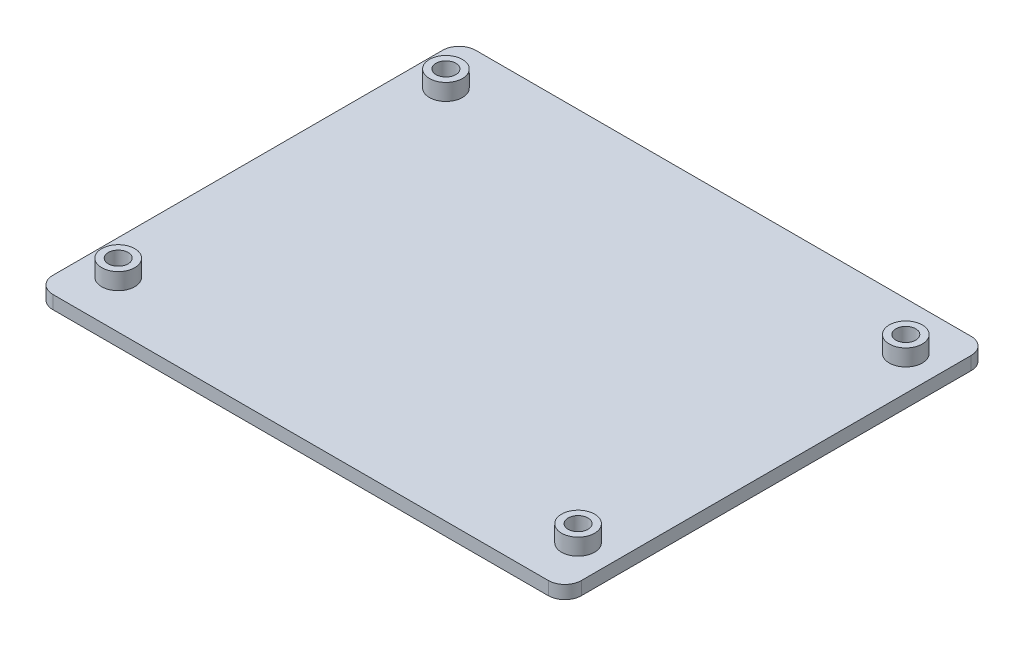
ISO-10303-21;
HEADER;
FILE_DESCRIPTION(('STEP AP214'),'2;1');
FILE_NAME('part.step','',(''),(''),'','','');
FILE_SCHEMA(('AUTOMOTIVE_DESIGN { 1 0 10303 214 1 1 1 1 }'));
ENDSEC;
DATA;
#1=APPLICATION_CONTEXT('core data for automotive mechanical design processes');
#2=APPLICATION_PROTOCOL_DEFINITION('international standard','automotive_design',2000,#1);
#3=PRODUCT_CONTEXT('',#1,'mechanical');
#4=PRODUCT('Part','Part','',(#3));
#5=PRODUCT_RELATED_PRODUCT_CATEGORY('part','',(#4));
#6=PRODUCT_DEFINITION_FORMATION('','',#4);
#7=PRODUCT_DEFINITION_CONTEXT('part definition',#1,'design');
#8=PRODUCT_DEFINITION('design','',#6,#7);
#9=PRODUCT_DEFINITION_SHAPE('','',#8);
#10=(LENGTH_UNIT() NAMED_UNIT(*) SI_UNIT(.MILLI.,.METRE.));
#11=(NAMED_UNIT(*) PLANE_ANGLE_UNIT() SI_UNIT($,.RADIAN.));
#12=(NAMED_UNIT(*) SI_UNIT($,.STERADIAN.) SOLID_ANGLE_UNIT());
#13=UNCERTAINTY_MEASURE_WITH_UNIT(LENGTH_MEASURE(1.E-05),#10,'distance_accuracy_value','');
#14=(GEOMETRIC_REPRESENTATION_CONTEXT(3) GLOBAL_UNCERTAINTY_ASSIGNED_CONTEXT((#13)) GLOBAL_UNIT_ASSIGNED_CONTEXT((#10,
#11,#12)) REPRESENTATION_CONTEXT('',''));
#15=CARTESIAN_POINT('',(0.,0.,0.));
#16=DIRECTION('',(0.,0.,1.));
#17=DIRECTION('',(1.,0.,0.));
#18=AXIS2_PLACEMENT_3D('',#15,#16,#17);
#19=CARTESIAN_POINT('',(40.,2.,32.));
#20=DIRECTION('',(-1.,0.,0.));
#21=DIRECTION('',(0.,0.,1.));
#22=AXIS2_PLACEMENT_3D('',#19,#20,#21);
#23=PLANE('',#22);
#24=DIRECTION('',(0.,0.,-1.));
#25=VECTOR('',#24,1.);
#26=CARTESIAN_POINT('',(40.,0.,32.));
#27=LINE('',#26,#25);
#28=CARTESIAN_POINT('',(40.,0.,29.5));
#29=VERTEX_POINT('',#28);
#30=CARTESIAN_POINT('',(40.,0.,-29.5));
#31=VERTEX_POINT('',#30);
#32=EDGE_CURVE('E149',#29,#31,#27,.T.);
#33=ORIENTED_EDGE('',*,*,#32,.T.);
#34=DIRECTION('',(0.,-1.,0.));
#35=VECTOR('',#34,1.);
#36=CARTESIAN_POINT('',(40.,2.,-29.5));
#37=LINE('',#36,#35);
#38=CARTESIAN_POINT('',(40.,2.,-29.5));
#39=VERTEX_POINT('',#38);
#40=EDGE_CURVE('E182',#31,#39,#37,.F.);
#41=ORIENTED_EDGE('',*,*,#40,.T.);
#42=DIRECTION('',(0.,0.,-1.));
#43=VECTOR('',#42,1.);
#44=CARTESIAN_POINT('',(40.,2.,32.));
#45=LINE('',#44,#43);
#46=CARTESIAN_POINT('',(40.,2.,29.5));
#47=VERTEX_POINT('',#46);
#48=EDGE_CURVE('E147',#47,#39,#45,.T.);
#49=ORIENTED_EDGE('',*,*,#48,.F.);
#50=DIRECTION('',(0.,-1.,0.));
#51=VECTOR('',#50,1.);
#52=CARTESIAN_POINT('',(40.,2.,29.5));
#53=LINE('',#52,#51);
#54=EDGE_CURVE('E178',#47,#29,#53,.T.);
#55=ORIENTED_EDGE('',*,*,#54,.T.);
#56=EDGE_LOOP('',(#33,#41,#49,#55));
#57=FACE_BOUND('',#56,.T.);
#58=ADVANCED_FACE('F45',(#57),#23,.F.);
#59=CARTESIAN_POINT('',(-40.,2.,-32.));
#60=DIRECTION('',(0.,0.,1.));
#61=DIRECTION('',(1.,0.,0.));
#62=AXIS2_PLACEMENT_3D('',#59,#60,#61);
#63=PLANE('',#62);
#64=DIRECTION('',(-1.,0.,0.));
#65=VECTOR('',#64,1.);
#66=CARTESIAN_POINT('',(-40.,0.,-32.));
#67=LINE('',#66,#65);
#68=CARTESIAN_POINT('',(37.5,0.,-32.));
#69=VERTEX_POINT('',#68);
#70=CARTESIAN_POINT('',(-37.5,0.,-32.));
#71=VERTEX_POINT('',#70);
#72=EDGE_CURVE('E143',#69,#71,#67,.T.);
#73=ORIENTED_EDGE('',*,*,#72,.T.);
#74=DIRECTION('',(0.,-1.,0.));
#75=VECTOR('',#74,1.);
#76=CARTESIAN_POINT('',(-37.5,2.,-32.));
#77=LINE('',#76,#75);
#78=CARTESIAN_POINT('',(-37.5,2.,-32.));
#79=VERTEX_POINT('',#78);
#80=EDGE_CURVE('E118',#71,#79,#77,.F.);
#81=ORIENTED_EDGE('',*,*,#80,.T.);
#82=DIRECTION('',(-1.,0.,0.));
#83=VECTOR('',#82,1.);
#84=CARTESIAN_POINT('',(-40.,2.,-32.));
#85=LINE('',#84,#83);
#86=CARTESIAN_POINT('',(37.5,2.,-32.));
#87=VERTEX_POINT('',#86);
#88=EDGE_CURVE('E215',#87,#79,#85,.T.);
#89=ORIENTED_EDGE('',*,*,#88,.F.);
#90=DIRECTION('',(0.,-1.,0.));
#91=VECTOR('',#90,1.);
#92=CARTESIAN_POINT('',(37.5,2.,-32.));
#93=LINE('',#92,#91);
#94=EDGE_CURVE('E124',#87,#69,#93,.T.);
#95=ORIENTED_EDGE('',*,*,#94,.T.);
#96=EDGE_LOOP('',(#73,#81,#89,#95));
#97=FACE_BOUND('',#96,.T.);
#98=ADVANCED_FACE('F306',(#97),#63,.F.);
#99=CARTESIAN_POINT('',(-40.,2.,32.));
#100=DIRECTION('',(1.,0.,0.));
#101=DIRECTION('',(0.,0.,-1.));
#102=AXIS2_PLACEMENT_3D('',#99,#100,#101);
#103=PLANE('',#102);
#104=DIRECTION('',(0.,0.,1.));
#105=VECTOR('',#104,1.);
#106=CARTESIAN_POINT('',(-40.,2.,32.));
#107=LINE('',#106,#105);
#108=CARTESIAN_POINT('',(-40.,2.,-29.5));
#109=VERTEX_POINT('',#108);
#110=CARTESIAN_POINT('',(-40.,2.,29.5));
#111=VERTEX_POINT('',#110);
#112=EDGE_CURVE('E133',#109,#111,#107,.T.);
#113=ORIENTED_EDGE('',*,*,#112,.F.);
#114=DIRECTION('',(0.,-1.,0.));
#115=VECTOR('',#114,1.);
#116=CARTESIAN_POINT('',(-40.,2.,-29.5));
#117=LINE('',#116,#115);
#118=CARTESIAN_POINT('',(-40.,0.,-29.5));
#119=VERTEX_POINT('',#118);
#120=EDGE_CURVE('E117',#109,#119,#117,.T.);
#121=ORIENTED_EDGE('',*,*,#120,.T.);
#122=DIRECTION('',(0.,0.,1.));
#123=VECTOR('',#122,1.);
#124=CARTESIAN_POINT('',(-40.,0.,32.));
#125=LINE('',#124,#123);
#126=CARTESIAN_POINT('',(-40.,0.,29.5));
#127=VERTEX_POINT('',#126);
#128=EDGE_CURVE('E131',#119,#127,#125,.T.);
#129=ORIENTED_EDGE('',*,*,#128,.T.);
#130=DIRECTION('',(0.,-1.,0.));
#131=VECTOR('',#130,1.);
#132=CARTESIAN_POINT('',(-40.,2.,29.5));
#133=LINE('',#132,#131);
#134=EDGE_CURVE('E136',#127,#111,#133,.F.);
#135=ORIENTED_EDGE('',*,*,#134,.T.);
#136=EDGE_LOOP('',(#113,#121,#129,#135));
#137=FACE_BOUND('',#136,.T.);
#138=ADVANCED_FACE('F130',(#137),#103,.F.);
#139=CARTESIAN_POINT('',(-40.,2.,32.));
#140=DIRECTION('',(0.,0.,-1.));
#141=DIRECTION('',(-1.,0.,0.));
#142=AXIS2_PLACEMENT_3D('',#139,#140,#141);
#143=PLANE('',#142);
#144=DIRECTION('',(1.,0.,0.));
#145=VECTOR('',#144,1.);
#146=CARTESIAN_POINT('',(-40.,2.,32.));
#147=LINE('',#146,#145);
#148=CARTESIAN_POINT('',(-37.5,2.,32.));
#149=VERTEX_POINT('',#148);
#150=CARTESIAN_POINT('',(37.5,2.,32.));
#151=VERTEX_POINT('',#150);
#152=EDGE_CURVE('E154',#149,#151,#147,.T.);
#153=ORIENTED_EDGE('',*,*,#152,.F.);
#154=DIRECTION('',(0.,-1.,0.));
#155=VECTOR('',#154,1.);
#156=CARTESIAN_POINT('',(-37.5,2.,32.));
#157=LINE('',#156,#155);
#158=CARTESIAN_POINT('',(-37.5,0.,32.));
#159=VERTEX_POINT('',#158);
#160=EDGE_CURVE('E187',#149,#159,#157,.T.);
#161=ORIENTED_EDGE('',*,*,#160,.T.);
#162=DIRECTION('',(1.,0.,0.));
#163=VECTOR('',#162,1.);
#164=CARTESIAN_POINT('',(-40.,0.,32.));
#165=LINE('',#164,#163);
#166=CARTESIAN_POINT('',(37.5,0.,32.));
#167=VERTEX_POINT('',#166);
#168=EDGE_CURVE('E142',#159,#167,#165,.T.);
#169=ORIENTED_EDGE('',*,*,#168,.T.);
#170=DIRECTION('',(0.,-1.,0.));
#171=VECTOR('',#170,1.);
#172=CARTESIAN_POINT('',(37.5,2.,32.));
#173=LINE('',#172,#171);
#174=EDGE_CURVE('E61',#167,#151,#173,.F.);
#175=ORIENTED_EDGE('',*,*,#174,.T.);
#176=EDGE_LOOP('',(#153,#161,#169,#175));
#177=FACE_BOUND('',#176,.T.);
#178=ADVANCED_FACE('F207',(#177),#143,.F.);
#179=CARTESIAN_POINT('',(0.,2.,0.));
#180=DIRECTION('',(0.,-1.,0.));
#181=DIRECTION('',(0.,0.,-1.));
#182=AXIS2_PLACEMENT_3D('',#179,#180,#181);
#183=PLANE('',#182);
#184=CARTESIAN_POINT('',(34.8,2.,24.8));
#185=DIRECTION('',(0.,-1.,0.));
#186=DIRECTION('',(0.,0.,-1.));
#187=AXIS2_PLACEMENT_3D('',#184,#185,#186);
#188=CIRCLE('',#187,2.5);
#189=CARTESIAN_POINT('',(34.8,2.,22.3));
#190=VERTEX_POINT('',#189);
#191=EDGE_CURVE('E11',#190,#190,#188,.F.);
#192=ORIENTED_EDGE('',*,*,#191,.F.);
#193=EDGE_LOOP('',(#192));
#194=FACE_BOUND('',#193,.T.);
#195=CARTESIAN_POINT('',(34.8,2.,-24.8));
#196=DIRECTION('',(0.,-1.,0.));
#197=DIRECTION('',(0.,0.,-1.));
#198=AXIS2_PLACEMENT_3D('',#195,#196,#197);
#199=CIRCLE('',#198,2.5);
#200=CARTESIAN_POINT('',(34.8,2.,-27.3));
#201=VERTEX_POINT('',#200);
#202=EDGE_CURVE('E54',#201,#201,#199,.F.);
#203=ORIENTED_EDGE('',*,*,#202,.F.);
#204=EDGE_LOOP('',(#203));
#205=FACE_BOUND('',#204,.T.);
#206=CARTESIAN_POINT('',(-34.8,2.,24.8));
#207=DIRECTION('',(0.,-1.,0.));
#208=DIRECTION('',(0.,0.,-1.));
#209=AXIS2_PLACEMENT_3D('',#206,#207,#208);
#210=CIRCLE('',#209,2.5);
#211=CARTESIAN_POINT('',(-34.8,2.,22.3));
#212=VERTEX_POINT('',#211);
#213=EDGE_CURVE('E195',#212,#212,#210,.F.);
#214=ORIENTED_EDGE('',*,*,#213,.F.);
#215=EDGE_LOOP('',(#214));
#216=FACE_BOUND('',#215,.T.);
#217=CARTESIAN_POINT('',(-34.8,2.,-24.8));
#218=DIRECTION('',(0.,-1.,0.));
#219=DIRECTION('',(0.,0.,-1.));
#220=AXIS2_PLACEMENT_3D('',#217,#218,#219);
#221=CIRCLE('',#220,2.5);
#222=CARTESIAN_POINT('',(-34.8,2.,-27.3));
#223=VERTEX_POINT('',#222);
#224=EDGE_CURVE('E191',#223,#223,#221,.F.);
#225=ORIENTED_EDGE('',*,*,#224,.F.);
#226=EDGE_LOOP('',(#225));
#227=FACE_BOUND('',#226,.T.);
#228=ORIENTED_EDGE('',*,*,#88,.T.);
#229=CARTESIAN_POINT('',(-37.5,2.,-29.5));
#230=DIRECTION('',(0.,-1.,0.));
#231=DIRECTION('',(0.,0.,-1.));
#232=AXIS2_PLACEMENT_3D('',#229,#230,#231);
#233=CIRCLE('',#232,2.5);
#234=EDGE_CURVE('E175',#79,#109,#233,.F.);
#235=ORIENTED_EDGE('',*,*,#234,.T.);
#236=ORIENTED_EDGE('',*,*,#112,.T.);
#237=CARTESIAN_POINT('',(-37.5,2.,29.5));
#238=DIRECTION('',(0.,-1.,0.));
#239=DIRECTION('',(0.,0.,-1.));
#240=AXIS2_PLACEMENT_3D('',#237,#238,#239);
#241=CIRCLE('',#240,2.5);
#242=EDGE_CURVE('E68',#111,#149,#241,.F.);
#243=ORIENTED_EDGE('',*,*,#242,.T.);
#244=ORIENTED_EDGE('',*,*,#152,.T.);
#245=CARTESIAN_POINT('',(37.5,2.,29.5));
#246=DIRECTION('',(0.,-1.,0.));
#247=DIRECTION('',(0.,0.,-1.));
#248=AXIS2_PLACEMENT_3D('',#245,#246,#247);
#249=CIRCLE('',#248,2.5);
#250=EDGE_CURVE('E167',#151,#47,#249,.F.);
#251=ORIENTED_EDGE('',*,*,#250,.T.);
#252=ORIENTED_EDGE('',*,*,#48,.T.);
#253=CARTESIAN_POINT('',(37.5,2.,-29.5));
#254=DIRECTION('',(0.,-1.,0.));
#255=DIRECTION('',(0.,0.,-1.));
#256=AXIS2_PLACEMENT_3D('',#253,#254,#255);
#257=CIRCLE('',#256,2.5);
#258=EDGE_CURVE('E172',#39,#87,#257,.F.);
#259=ORIENTED_EDGE('',*,*,#258,.T.);
#260=EDGE_LOOP('',(#228,#235,#236,#243,#244,#251,#252,#259));
#261=FACE_BOUND('',#260,.T.);
#262=ADVANCED_FACE('F204',(#194,#205,#216,#227,#261),#183,.F.);
#263=CARTESIAN_POINT('',(0.,0.,0.));
#264=DIRECTION('',(0.,-1.,0.));
#265=DIRECTION('',(0.,0.,-1.));
#266=AXIS2_PLACEMENT_3D('',#263,#264,#265);
#267=PLANE('',#266);
#268=CARTESIAN_POINT('',(-34.8,0.,24.8));
#269=DIRECTION('',(0.,-1.,0.));
#270=DIRECTION('',(0.,0.,-1.));
#271=AXIS2_PLACEMENT_3D('',#268,#269,#270);
#272=CIRCLE('',#271,1.49999999999999);
#273=CARTESIAN_POINT('',(-34.8,0.,23.3));
#274=VERTEX_POINT('',#273);
#275=EDGE_CURVE('E245',#274,#274,#272,.F.);
#276=ORIENTED_EDGE('',*,*,#275,.T.);
#277=EDGE_LOOP('',(#276));
#278=FACE_BOUND('',#277,.T.);
#279=CARTESIAN_POINT('',(34.8,0.,24.8));
#280=DIRECTION('',(0.,-1.,0.));
#281=DIRECTION('',(0.,0.,-1.));
#282=AXIS2_PLACEMENT_3D('',#279,#280,#281);
#283=CIRCLE('',#282,1.5);
#284=CARTESIAN_POINT('',(34.8,0.,23.3));
#285=VERTEX_POINT('',#284);
#286=EDGE_CURVE('E242',#285,#285,#283,.F.);
#287=ORIENTED_EDGE('',*,*,#286,.T.);
#288=EDGE_LOOP('',(#287));
#289=FACE_BOUND('',#288,.T.);
#290=CARTESIAN_POINT('',(34.8,0.,-24.8));
#291=DIRECTION('',(0.,-1.,0.));
#292=DIRECTION('',(0.,0.,-1.));
#293=AXIS2_PLACEMENT_3D('',#290,#291,#292);
#294=CIRCLE('',#293,1.49999999999999);
#295=CARTESIAN_POINT('',(34.8,0.,-26.3));
#296=VERTEX_POINT('',#295);
#297=EDGE_CURVE('E237',#296,#296,#294,.F.);
#298=ORIENTED_EDGE('',*,*,#297,.T.);
#299=EDGE_LOOP('',(#298));
#300=FACE_BOUND('',#299,.T.);
#301=CARTESIAN_POINT('',(-34.8,0.,-24.8));
#302=DIRECTION('',(0.,-1.,0.));
#303=DIRECTION('',(0.,0.,-1.));
#304=AXIS2_PLACEMENT_3D('',#301,#302,#303);
#305=CIRCLE('',#304,1.49999999999999);
#306=CARTESIAN_POINT('',(-34.8,0.,-26.3));
#307=VERTEX_POINT('',#306);
#308=EDGE_CURVE('E231',#307,#307,#305,.F.);
#309=ORIENTED_EDGE('',*,*,#308,.T.);
#310=EDGE_LOOP('',(#309));
#311=FACE_BOUND('',#310,.T.);
#312=ORIENTED_EDGE('',*,*,#128,.F.);
#313=CARTESIAN_POINT('',(-37.5,0.,-29.5));
#314=DIRECTION('',(0.,-1.,0.));
#315=DIRECTION('',(0.,0.,-1.));
#316=AXIS2_PLACEMENT_3D('',#313,#314,#315);
#317=CIRCLE('',#316,2.5);
#318=EDGE_CURVE('E113',#119,#71,#317,.T.);
#319=ORIENTED_EDGE('',*,*,#318,.T.);
#320=ORIENTED_EDGE('',*,*,#72,.F.);
#321=CARTESIAN_POINT('',(37.5,0.,-29.5));
#322=DIRECTION('',(0.,-1.,0.));
#323=DIRECTION('',(0.,0.,-1.));
#324=AXIS2_PLACEMENT_3D('',#321,#322,#323);
#325=CIRCLE('',#324,2.5);
#326=EDGE_CURVE('E125',#69,#31,#325,.T.);
#327=ORIENTED_EDGE('',*,*,#326,.T.);
#328=ORIENTED_EDGE('',*,*,#32,.F.);
#329=CARTESIAN_POINT('',(37.5,0.,29.5));
#330=DIRECTION('',(0.,-1.,0.));
#331=DIRECTION('',(0.,0.,-1.));
#332=AXIS2_PLACEMENT_3D('',#329,#330,#331);
#333=CIRCLE('',#332,2.5);
#334=EDGE_CURVE('E135',#29,#167,#333,.T.);
#335=ORIENTED_EDGE('',*,*,#334,.T.);
#336=ORIENTED_EDGE('',*,*,#168,.F.);
#337=CARTESIAN_POINT('',(-37.5,0.,29.5));
#338=DIRECTION('',(0.,-1.,0.));
#339=DIRECTION('',(0.,0.,-1.));
#340=AXIS2_PLACEMENT_3D('',#337,#338,#339);
#341=CIRCLE('',#340,2.5);
#342=EDGE_CURVE('E140',#159,#127,#341,.T.);
#343=ORIENTED_EDGE('',*,*,#342,.T.);
#344=EDGE_LOOP('',(#312,#319,#320,#327,#328,#335,#336,#343));
#345=FACE_BOUND('',#344,.T.);
#346=ADVANCED_FACE('F138',(#278,#289,#300,#311,#345),#267,.T.);
#347=CARTESIAN_POINT('',(-37.5,2.,-29.5));
#348=DIRECTION('',(0.,-1.,0.));
#349=DIRECTION('',(0.,0.,-1.));
#350=AXIS2_PLACEMENT_3D('',#347,#348,#349);
#351=CYLINDRICAL_SURFACE('',#350,2.5);
#352=ORIENTED_EDGE('',*,*,#234,.F.);
#353=ORIENTED_EDGE('',*,*,#80,.F.);
#354=ORIENTED_EDGE('',*,*,#318,.F.);
#355=ORIENTED_EDGE('',*,*,#120,.F.);
#356=EDGE_LOOP('',(#352,#353,#354,#355));
#357=FACE_BOUND('',#356,.T.);
#358=ADVANCED_FACE('F116',(#357),#351,.T.);
#359=CARTESIAN_POINT('',(37.5,2.,-29.5));
#360=DIRECTION('',(0.,-1.,0.));
#361=DIRECTION('',(0.,0.,-1.));
#362=AXIS2_PLACEMENT_3D('',#359,#360,#361);
#363=CYLINDRICAL_SURFACE('',#362,2.5);
#364=ORIENTED_EDGE('',*,*,#258,.F.);
#365=ORIENTED_EDGE('',*,*,#40,.F.);
#366=ORIENTED_EDGE('',*,*,#326,.F.);
#367=ORIENTED_EDGE('',*,*,#94,.F.);
#368=EDGE_LOOP('',(#364,#365,#366,#367));
#369=FACE_BOUND('',#368,.T.);
#370=ADVANCED_FACE('F316',(#369),#363,.T.);
#371=CARTESIAN_POINT('',(-37.5,2.,29.5));
#372=DIRECTION('',(0.,-1.,0.));
#373=DIRECTION('',(0.,0.,-1.));
#374=AXIS2_PLACEMENT_3D('',#371,#372,#373);
#375=CYLINDRICAL_SURFACE('',#374,2.5);
#376=ORIENTED_EDGE('',*,*,#242,.F.);
#377=ORIENTED_EDGE('',*,*,#134,.F.);
#378=ORIENTED_EDGE('',*,*,#342,.F.);
#379=ORIENTED_EDGE('',*,*,#160,.F.);
#380=EDGE_LOOP('',(#376,#377,#378,#379));
#381=FACE_BOUND('',#380,.T.);
#382=ADVANCED_FACE('F318',(#381),#375,.T.);
#383=CARTESIAN_POINT('',(37.5,2.,29.5));
#384=DIRECTION('',(0.,-1.,0.));
#385=DIRECTION('',(0.,0.,-1.));
#386=AXIS2_PLACEMENT_3D('',#383,#384,#385);
#387=CYLINDRICAL_SURFACE('',#386,2.5);
#388=ORIENTED_EDGE('',*,*,#250,.F.);
#389=ORIENTED_EDGE('',*,*,#174,.F.);
#390=ORIENTED_EDGE('',*,*,#334,.F.);
#391=ORIENTED_EDGE('',*,*,#54,.F.);
#392=EDGE_LOOP('',(#388,#389,#390,#391));
#393=FACE_BOUND('',#392,.T.);
#394=ADVANCED_FACE('F47',(#393),#387,.T.);
#395=CARTESIAN_POINT('',(-34.8,-4.24264068711927,-24.8));
#396=DIRECTION('',(0.,1.,0.));
#397=DIRECTION('',(0.,0.,1.));
#398=AXIS2_PLACEMENT_3D('',#395,#396,#397);
#399=CYLINDRICAL_SURFACE('',#398,1.49999999999999);
#400=ORIENTED_EDGE('',*,*,#308,.F.);
#401=EDGE_LOOP('',(#400));
#402=FACE_BOUND('',#401,.T.);
#403=CARTESIAN_POINT('',(-34.8,4.5,-24.8));
#404=DIRECTION('',(0.,1.,0.));
#405=DIRECTION('',(0.,0.,1.));
#406=AXIS2_PLACEMENT_3D('',#403,#404,#405);
#407=CIRCLE('',#406,1.49999999999999);
#408=CARTESIAN_POINT('',(-34.8,4.5,-23.3));
#409=VERTEX_POINT('',#408);
#410=EDGE_CURVE('E256',#409,#409,#407,.F.);
#411=ORIENTED_EDGE('',*,*,#410,.F.);
#412=EDGE_LOOP('',(#411));
#413=FACE_BOUND('',#412,.T.);
#414=ADVANCED_FACE('F301',(#402,#413),#399,.F.);
#415=CARTESIAN_POINT('',(34.8,-4.24264068711927,-24.8));
#416=DIRECTION('',(0.,1.,0.));
#417=DIRECTION('',(0.,0.,1.));
#418=AXIS2_PLACEMENT_3D('',#415,#416,#417);
#419=CYLINDRICAL_SURFACE('',#418,1.49999999999999);
#420=ORIENTED_EDGE('',*,*,#297,.F.);
#421=EDGE_LOOP('',(#420));
#422=FACE_BOUND('',#421,.T.);
#423=CARTESIAN_POINT('',(34.8,4.5,-24.8));
#424=DIRECTION('',(0.,1.,0.));
#425=DIRECTION('',(0.,0.,1.));
#426=AXIS2_PLACEMENT_3D('',#423,#424,#425);
#427=CIRCLE('',#426,1.49999999999999);
#428=CARTESIAN_POINT('',(34.8,4.5,-23.3));
#429=VERTEX_POINT('',#428);
#430=EDGE_CURVE('E272',#429,#429,#427,.F.);
#431=ORIENTED_EDGE('',*,*,#430,.F.);
#432=EDGE_LOOP('',(#431));
#433=FACE_BOUND('',#432,.T.);
#434=ADVANCED_FACE('F291',(#422,#433),#419,.F.);
#435=CARTESIAN_POINT('',(34.8,-4.24264068711927,24.8));
#436=DIRECTION('',(0.,1.,0.));
#437=DIRECTION('',(0.,0.,1.));
#438=AXIS2_PLACEMENT_3D('',#435,#436,#437);
#439=CYLINDRICAL_SURFACE('',#438,1.5);
#440=ORIENTED_EDGE('',*,*,#286,.F.);
#441=EDGE_LOOP('',(#440));
#442=FACE_BOUND('',#441,.T.);
#443=CARTESIAN_POINT('',(34.8,4.5,24.8));
#444=DIRECTION('',(0.,1.,0.));
#445=DIRECTION('',(0.,0.,1.));
#446=AXIS2_PLACEMENT_3D('',#443,#444,#445);
#447=CIRCLE('',#446,1.5);
#448=CARTESIAN_POINT('',(34.8,4.5,26.3));
#449=VERTEX_POINT('',#448);
#450=EDGE_CURVE('E280',#449,#449,#447,.F.);
#451=ORIENTED_EDGE('',*,*,#450,.F.);
#452=EDGE_LOOP('',(#451));
#453=FACE_BOUND('',#452,.T.);
#454=ADVANCED_FACE('F288',(#442,#453),#439,.F.);
#455=CARTESIAN_POINT('',(-34.8,-4.24264068711927,24.8));
#456=DIRECTION('',(0.,1.,0.));
#457=DIRECTION('',(0.,0.,1.));
#458=AXIS2_PLACEMENT_3D('',#455,#456,#457);
#459=CYLINDRICAL_SURFACE('',#458,1.49999999999999);
#460=ORIENTED_EDGE('',*,*,#275,.F.);
#461=EDGE_LOOP('',(#460));
#462=FACE_BOUND('',#461,.T.);
#463=CARTESIAN_POINT('',(-34.8,4.5,24.8));
#464=DIRECTION('',(0.,1.,0.));
#465=DIRECTION('',(0.,0.,1.));
#466=AXIS2_PLACEMENT_3D('',#463,#464,#465);
#467=CIRCLE('',#466,1.49999999999999);
#468=CARTESIAN_POINT('',(-34.8,4.5,26.3));
#469=VERTEX_POINT('',#468);
#470=EDGE_CURVE('E264',#469,#469,#467,.F.);
#471=ORIENTED_EDGE('',*,*,#470,.F.);
#472=EDGE_LOOP('',(#471));
#473=FACE_BOUND('',#472,.T.);
#474=ADVANCED_FACE('F290',(#462,#473),#459,.F.);
#475=CARTESIAN_POINT('',(-34.8,4.5,-24.8));
#476=DIRECTION('',(0.,-1.,0.));
#477=DIRECTION('',(0.,0.,-1.));
#478=AXIS2_PLACEMENT_3D('',#475,#476,#477);
#479=CYLINDRICAL_SURFACE('',#478,2.5);
#480=CARTESIAN_POINT('',(-34.8,4.5,-24.8));
#481=DIRECTION('',(0.,1.,0.));
#482=DIRECTION('',(0.,0.,1.));
#483=AXIS2_PLACEMENT_3D('',#480,#481,#482);
#484=CIRCLE('',#483,2.5);
#485=CARTESIAN_POINT('',(-34.8,4.5,-22.3));
#486=VERTEX_POINT('',#485);
#487=EDGE_CURVE('E249',#486,#486,#484,.T.);
#488=ORIENTED_EDGE('',*,*,#487,.F.);
#489=EDGE_LOOP('',(#488));
#490=FACE_BOUND('',#489,.T.);
#491=ORIENTED_EDGE('',*,*,#224,.T.);
#492=EDGE_LOOP('',(#491));
#493=FACE_BOUND('',#492,.T.);
#494=ADVANCED_FACE('F298',(#490,#493),#479,.T.);
#495=CARTESIAN_POINT('',(0.,4.5,0.));
#496=DIRECTION('',(0.,1.,0.));
#497=DIRECTION('',(0.,0.,1.));
#498=AXIS2_PLACEMENT_3D('',#495,#496,#497);
#499=PLANE('',#498);
#500=ORIENTED_EDGE('',*,*,#410,.T.);
#501=EDGE_LOOP('',(#500));
#502=FACE_BOUND('',#501,.T.);
#503=ORIENTED_EDGE('',*,*,#487,.T.);
#504=EDGE_LOOP('',(#503));
#505=FACE_BOUND('',#504,.T.);
#506=ADVANCED_FACE('F347',(#502,#505),#499,.T.);
#507=CARTESIAN_POINT('',(-34.8,4.5,24.8));
#508=DIRECTION('',(0.,-1.,0.));
#509=DIRECTION('',(0.,0.,-1.));
#510=AXIS2_PLACEMENT_3D('',#507,#508,#509);
#511=CYLINDRICAL_SURFACE('',#510,2.5);
#512=CARTESIAN_POINT('',(-34.8,4.5,24.8));
#513=DIRECTION('',(0.,1.,0.));
#514=DIRECTION('',(0.,0.,1.));
#515=AXIS2_PLACEMENT_3D('',#512,#513,#514);
#516=CIRCLE('',#515,2.5);
#517=CARTESIAN_POINT('',(-34.8,4.5,27.3));
#518=VERTEX_POINT('',#517);
#519=EDGE_CURVE('E260',#518,#518,#516,.T.);
#520=ORIENTED_EDGE('',*,*,#519,.F.);
#521=EDGE_LOOP('',(#520));
#522=FACE_BOUND('',#521,.T.);
#523=ORIENTED_EDGE('',*,*,#213,.T.);
#524=EDGE_LOOP('',(#523));
#525=FACE_BOUND('',#524,.T.);
#526=ADVANCED_FACE('F350',(#522,#525),#511,.T.);
#527=CARTESIAN_POINT('',(0.,4.5,0.));
#528=DIRECTION('',(0.,1.,0.));
#529=DIRECTION('',(0.,0.,1.));
#530=AXIS2_PLACEMENT_3D('',#527,#528,#529);
#531=PLANE('',#530);
#532=ORIENTED_EDGE('',*,*,#470,.T.);
#533=EDGE_LOOP('',(#532));
#534=FACE_BOUND('',#533,.T.);
#535=ORIENTED_EDGE('',*,*,#519,.T.);
#536=EDGE_LOOP('',(#535));
#537=FACE_BOUND('',#536,.T.);
#538=ADVANCED_FACE('F362',(#534,#537),#531,.T.);
#539=CARTESIAN_POINT('',(34.8,4.5,-24.8));
#540=DIRECTION('',(0.,-1.,0.));
#541=DIRECTION('',(0.,0.,-1.));
#542=AXIS2_PLACEMENT_3D('',#539,#540,#541);
#543=CYLINDRICAL_SURFACE('',#542,2.5);
#544=CARTESIAN_POINT('',(34.8,4.5,-24.8));
#545=DIRECTION('',(0.,1.,0.));
#546=DIRECTION('',(0.,0.,1.));
#547=AXIS2_PLACEMENT_3D('',#544,#545,#546);
#548=CIRCLE('',#547,2.5);
#549=CARTESIAN_POINT('',(34.8,4.5,-22.3));
#550=VERTEX_POINT('',#549);
#551=EDGE_CURVE('E268',#550,#550,#548,.T.);
#552=ORIENTED_EDGE('',*,*,#551,.F.);
#553=EDGE_LOOP('',(#552));
#554=FACE_BOUND('',#553,.T.);
#555=ORIENTED_EDGE('',*,*,#202,.T.);
#556=EDGE_LOOP('',(#555));
#557=FACE_BOUND('',#556,.T.);
#558=ADVANCED_FACE('F202',(#554,#557),#543,.T.);
#559=CARTESIAN_POINT('',(0.,4.5,0.));
#560=DIRECTION('',(0.,1.,0.));
#561=DIRECTION('',(0.,0.,1.));
#562=AXIS2_PLACEMENT_3D('',#559,#560,#561);
#563=PLANE('',#562);
#564=ORIENTED_EDGE('',*,*,#430,.T.);
#565=EDGE_LOOP('',(#564));
#566=FACE_BOUND('',#565,.T.);
#567=ORIENTED_EDGE('',*,*,#551,.T.);
#568=EDGE_LOOP('',(#567));
#569=FACE_BOUND('',#568,.T.);
#570=ADVANCED_FACE('F369',(#566,#569),#563,.T.);
#571=CARTESIAN_POINT('',(34.8,4.5,24.8));
#572=DIRECTION('',(0.,-1.,0.));
#573=DIRECTION('',(0.,0.,-1.));
#574=AXIS2_PLACEMENT_3D('',#571,#572,#573);
#575=CYLINDRICAL_SURFACE('',#574,2.5);
#576=CARTESIAN_POINT('',(34.8,4.5,24.8));
#577=DIRECTION('',(0.,1.,0.));
#578=DIRECTION('',(0.,0.,1.));
#579=AXIS2_PLACEMENT_3D('',#576,#577,#578);
#580=CIRCLE('',#579,2.5);
#581=CARTESIAN_POINT('',(34.8,4.5,27.3));
#582=VERTEX_POINT('',#581);
#583=EDGE_CURVE('E276',#582,#582,#580,.T.);
#584=ORIENTED_EDGE('',*,*,#583,.F.);
#585=EDGE_LOOP('',(#584));
#586=FACE_BOUND('',#585,.T.);
#587=ORIENTED_EDGE('',*,*,#191,.T.);
#588=EDGE_LOOP('',(#587));
#589=FACE_BOUND('',#588,.T.);
#590=ADVANCED_FACE('F373',(#586,#589),#575,.T.);
#591=CARTESIAN_POINT('',(0.,4.5,0.));
#592=DIRECTION('',(0.,1.,0.));
#593=DIRECTION('',(0.,0.,1.));
#594=AXIS2_PLACEMENT_3D('',#591,#592,#593);
#595=PLANE('',#594);
#596=ORIENTED_EDGE('',*,*,#450,.T.);
#597=EDGE_LOOP('',(#596));
#598=FACE_BOUND('',#597,.T.);
#599=ORIENTED_EDGE('',*,*,#583,.T.);
#600=EDGE_LOOP('',(#599));
#601=FACE_BOUND('',#600,.T.);
#602=ADVANCED_FACE('F285',(#598,#601),#595,.T.);
#603=CLOSED_SHELL('',(#58,#98,#138,#178,#262,#346,#358,#370,#382,#394,#414,#434,#454,#474,#494,
#506,#526,#538,#558,#570,#590,#602));
#604=MANIFOLD_SOLID_BREP('B2',#603);
#605=ADVANCED_BREP_SHAPE_REPRESENTATION('',(#18,#604),#14);
#606=SHAPE_DEFINITION_REPRESENTATION(#9,#605);
ENDSEC;
END-ISO-10303-21;
